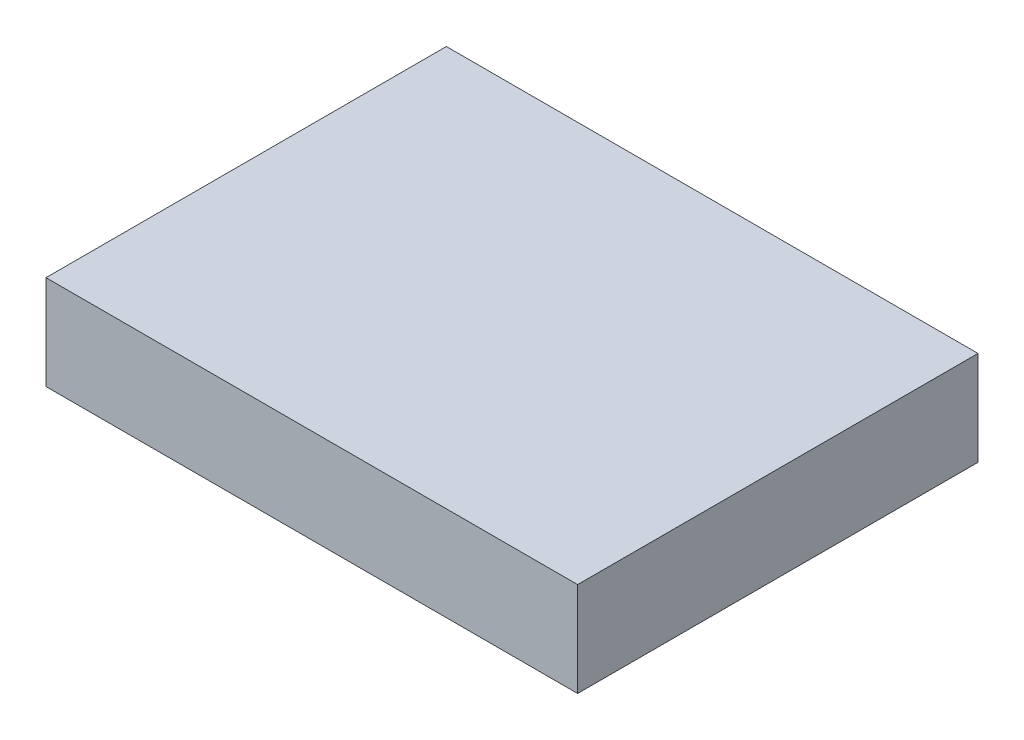
ISO-10303-21;
HEADER;
FILE_DESCRIPTION(('STEP AP214'),'2;1');
FILE_NAME('part.step','',(''),(''),'','','');
FILE_SCHEMA(('AUTOMOTIVE_DESIGN { 1 0 10303 214 1 1 1 1 }'));
ENDSEC;
DATA;
#1=APPLICATION_CONTEXT('core data for automotive mechanical design processes');
#2=APPLICATION_PROTOCOL_DEFINITION('international standard','automotive_design',2000,#1);
#3=PRODUCT_CONTEXT('',#1,'mechanical');
#4=PRODUCT('Part','Part','',(#3));
#5=PRODUCT_RELATED_PRODUCT_CATEGORY('part','',(#4));
#6=PRODUCT_DEFINITION_FORMATION('','',#4);
#7=PRODUCT_DEFINITION_CONTEXT('part definition',#1,'design');
#8=PRODUCT_DEFINITION('design','',#6,#7);
#9=PRODUCT_DEFINITION_SHAPE('','',#8);
#10=(LENGTH_UNIT() NAMED_UNIT(*) SI_UNIT(.MILLI.,.METRE.));
#11=(NAMED_UNIT(*) PLANE_ANGLE_UNIT() SI_UNIT($,.RADIAN.));
#12=(NAMED_UNIT(*) SI_UNIT($,.STERADIAN.) SOLID_ANGLE_UNIT());
#13=UNCERTAINTY_MEASURE_WITH_UNIT(LENGTH_MEASURE(1.E-05),#10,'distance_accuracy_value','');
#14=(GEOMETRIC_REPRESENTATION_CONTEXT(3) GLOBAL_UNCERTAINTY_ASSIGNED_CONTEXT((#13)) GLOBAL_UNIT_ASSIGNED_CONTEXT((#10,
#11,#12)) REPRESENTATION_CONTEXT('',''));
#15=CARTESIAN_POINT('',(0.,0.,0.));
#16=DIRECTION('',(0.,0.,1.));
#17=DIRECTION('',(1.,0.,0.));
#18=AXIS2_PLACEMENT_3D('',#15,#16,#17);
#19=CARTESIAN_POINT('',(26.4920943134536,16.,-31.846879334258));
#20=DIRECTION('',(1.,0.,0.));
#21=DIRECTION('',(0.,0.,-1.));
#22=AXIS2_PLACEMENT_3D('',#19,#20,#21);
#23=PLANE('',#22);
#24=DIRECTION('',(0.,0.,1.));
#25=VECTOR('',#24,1.);
#26=CARTESIAN_POINT('',(26.4920943134536,0.,-31.846879334258));
#27=LINE('',#26,#25);
#28=CARTESIAN_POINT('',(26.4920943134536,0.,-31.846879334258));
#29=VERTEX_POINT('',#28);
#30=CARTESIAN_POINT('',(26.4920943134536,0.,36.0743411927878));
#31=VERTEX_POINT('',#30);
#32=EDGE_CURVE('E99',#29,#31,#27,.T.);
#33=ORIENTED_EDGE('',*,*,#32,.T.);
#34=DIRECTION('',(0.,-1.,0.));
#35=VECTOR('',#34,1.);
#36=CARTESIAN_POINT('',(26.4920943134536,16.,36.0743411927878));
#37=LINE('',#36,#35);
#38=CARTESIAN_POINT('',(26.4920943134536,16.,36.0743411927878));
#39=VERTEX_POINT('',#38);
#40=EDGE_CURVE('E11',#39,#31,#37,.T.);
#41=ORIENTED_EDGE('',*,*,#40,.F.);
#42=DIRECTION('',(0.,0.,1.));
#43=VECTOR('',#42,1.);
#44=CARTESIAN_POINT('',(26.4920943134536,16.,-31.846879334258));
#45=LINE('',#44,#43);
#46=CARTESIAN_POINT('',(26.4920943134536,16.,-31.846879334258));
#47=VERTEX_POINT('',#46);
#48=EDGE_CURVE('E87',#47,#39,#45,.T.);
#49=ORIENTED_EDGE('',*,*,#48,.F.);
#50=DIRECTION('',(0.,-1.,0.));
#51=VECTOR('',#50,1.);
#52=CARTESIAN_POINT('',(26.4920943134536,16.,-31.846879334258));
#53=LINE('',#52,#51);
#54=EDGE_CURVE('E95',#47,#29,#53,.T.);
#55=ORIENTED_EDGE('',*,*,#54,.T.);
#56=EDGE_LOOP('',(#33,#41,#49,#55));
#57=FACE_BOUND('',#56,.T.);
#58=ADVANCED_FACE('F36',(#57),#23,.F.);
#59=CARTESIAN_POINT('',(26.4920943134536,16.,36.0743411927878));
#60=DIRECTION('',(0.,0.,-1.));
#61=DIRECTION('',(-1.,0.,0.));
#62=AXIS2_PLACEMENT_3D('',#59,#60,#61);
#63=PLANE('',#62);
#64=DIRECTION('',(1.,0.,0.));
#65=VECTOR('',#64,1.);
#66=CARTESIAN_POINT('',(26.4920943134536,0.,36.0743411927878));
#67=LINE('',#66,#65);
#68=CARTESIAN_POINT('',(116.677947295423,0.,36.0743411927878));
#69=VERTEX_POINT('',#68);
#70=EDGE_CURVE('E91',#31,#69,#67,.T.);
#71=ORIENTED_EDGE('',*,*,#70,.T.);
#72=DIRECTION('',(0.,-1.,0.));
#73=VECTOR('',#72,1.);
#74=CARTESIAN_POINT('',(116.677947295423,16.,36.0743411927878));
#75=LINE('',#74,#73);
#76=CARTESIAN_POINT('',(116.677947295423,16.,36.0743411927878));
#77=VERTEX_POINT('',#76);
#78=EDGE_CURVE('E44',#77,#69,#75,.T.);
#79=ORIENTED_EDGE('',*,*,#78,.F.);
#80=DIRECTION('',(1.,0.,0.));
#81=VECTOR('',#80,1.);
#82=CARTESIAN_POINT('',(26.4920943134536,16.,36.0743411927878));
#83=LINE('',#82,#81);
#84=EDGE_CURVE('E82',#39,#77,#83,.T.);
#85=ORIENTED_EDGE('',*,*,#84,.F.);
#86=ORIENTED_EDGE('',*,*,#40,.T.);
#87=EDGE_LOOP('',(#71,#79,#85,#86));
#88=FACE_BOUND('',#87,.T.);
#89=ADVANCED_FACE('F90',(#88),#63,.F.);
#90=CARTESIAN_POINT('',(116.677947295423,16.,-31.846879334258));
#91=DIRECTION('',(-1.,0.,0.));
#92=DIRECTION('',(0.,0.,1.));
#93=AXIS2_PLACEMENT_3D('',#90,#91,#92);
#94=PLANE('',#93);
#95=DIRECTION('',(0.,0.,-1.));
#96=VECTOR('',#95,1.);
#97=CARTESIAN_POINT('',(116.677947295423,0.,-31.846879334258));
#98=LINE('',#97,#96);
#99=CARTESIAN_POINT('',(116.677947295423,0.,-31.846879334258));
#100=VERTEX_POINT('',#99);
#101=EDGE_CURVE('E69',#69,#100,#98,.T.);
#102=ORIENTED_EDGE('',*,*,#101,.T.);
#103=DIRECTION('',(0.,-1.,0.));
#104=VECTOR('',#103,1.);
#105=CARTESIAN_POINT('',(116.677947295423,16.,-31.846879334258));
#106=LINE('',#105,#104);
#107=CARTESIAN_POINT('',(116.677947295423,16.,-31.846879334258));
#108=VERTEX_POINT('',#107);
#109=EDGE_CURVE('E92',#108,#100,#106,.T.);
#110=ORIENTED_EDGE('',*,*,#109,.F.);
#111=DIRECTION('',(0.,0.,-1.));
#112=VECTOR('',#111,1.);
#113=CARTESIAN_POINT('',(116.677947295423,16.,-31.846879334258));
#114=LINE('',#113,#112);
#115=EDGE_CURVE('E85',#77,#108,#114,.T.);
#116=ORIENTED_EDGE('',*,*,#115,.F.);
#117=ORIENTED_EDGE('',*,*,#78,.T.);
#118=EDGE_LOOP('',(#102,#110,#116,#117));
#119=FACE_BOUND('',#118,.T.);
#120=ADVANCED_FACE('F93',(#119),#94,.F.);
#121=CARTESIAN_POINT('',(26.4920943134536,16.,-31.846879334258));
#122=DIRECTION('',(0.,0.,1.));
#123=DIRECTION('',(1.,0.,0.));
#124=AXIS2_PLACEMENT_3D('',#121,#122,#123);
#125=PLANE('',#124);
#126=DIRECTION('',(-1.,0.,0.));
#127=VECTOR('',#126,1.);
#128=CARTESIAN_POINT('',(26.4920943134536,0.,-31.846879334258));
#129=LINE('',#128,#127);
#130=EDGE_CURVE('E75',#100,#29,#129,.T.);
#131=ORIENTED_EDGE('',*,*,#130,.T.);
#132=ORIENTED_EDGE('',*,*,#54,.F.);
#133=DIRECTION('',(-1.,0.,0.));
#134=VECTOR('',#133,1.);
#135=CARTESIAN_POINT('',(26.4920943134536,16.,-31.846879334258));
#136=LINE('',#135,#134);
#137=EDGE_CURVE('E52',#108,#47,#136,.T.);
#138=ORIENTED_EDGE('',*,*,#137,.F.);
#139=ORIENTED_EDGE('',*,*,#109,.T.);
#140=EDGE_LOOP('',(#131,#132,#138,#139));
#141=FACE_BOUND('',#140,.T.);
#142=ADVANCED_FACE('F106',(#141),#125,.F.);
#143=CARTESIAN_POINT('',(0.,16.,0.));
#144=DIRECTION('',(0.,1.,0.));
#145=DIRECTION('',(0.,0.,1.));
#146=AXIS2_PLACEMENT_3D('',#143,#144,#145);
#147=PLANE('',#146);
#148=ORIENTED_EDGE('',*,*,#48,.T.);
#149=ORIENTED_EDGE('',*,*,#84,.T.);
#150=ORIENTED_EDGE('',*,*,#115,.T.);
#151=ORIENTED_EDGE('',*,*,#137,.T.);
#152=EDGE_LOOP('',(#148,#149,#150,#151));
#153=FACE_BOUND('',#152,.T.);
#154=ADVANCED_FACE('F83',(#153),#147,.T.);
#155=CARTESIAN_POINT('',(0.,0.,0.));
#156=DIRECTION('',(0.,1.,0.));
#157=DIRECTION('',(0.,0.,1.));
#158=AXIS2_PLACEMENT_3D('',#155,#156,#157);
#159=PLANE('',#158);
#160=ORIENTED_EDGE('',*,*,#32,.F.);
#161=ORIENTED_EDGE('',*,*,#130,.F.);
#162=ORIENTED_EDGE('',*,*,#101,.F.);
#163=ORIENTED_EDGE('',*,*,#70,.F.);
#164=EDGE_LOOP('',(#160,#161,#162,#163));
#165=FACE_BOUND('',#164,.T.);
#166=ADVANCED_FACE('F109',(#165),#159,.F.);
#167=CLOSED_SHELL('',(#58,#89,#120,#142,#154,#166));
#168=MANIFOLD_SOLID_BREP('B2',#167);
#169=ADVANCED_BREP_SHAPE_REPRESENTATION('',(#18,#168),#14);
#170=SHAPE_DEFINITION_REPRESENTATION(#9,#169);
ENDSEC;
END-ISO-10303-21;
